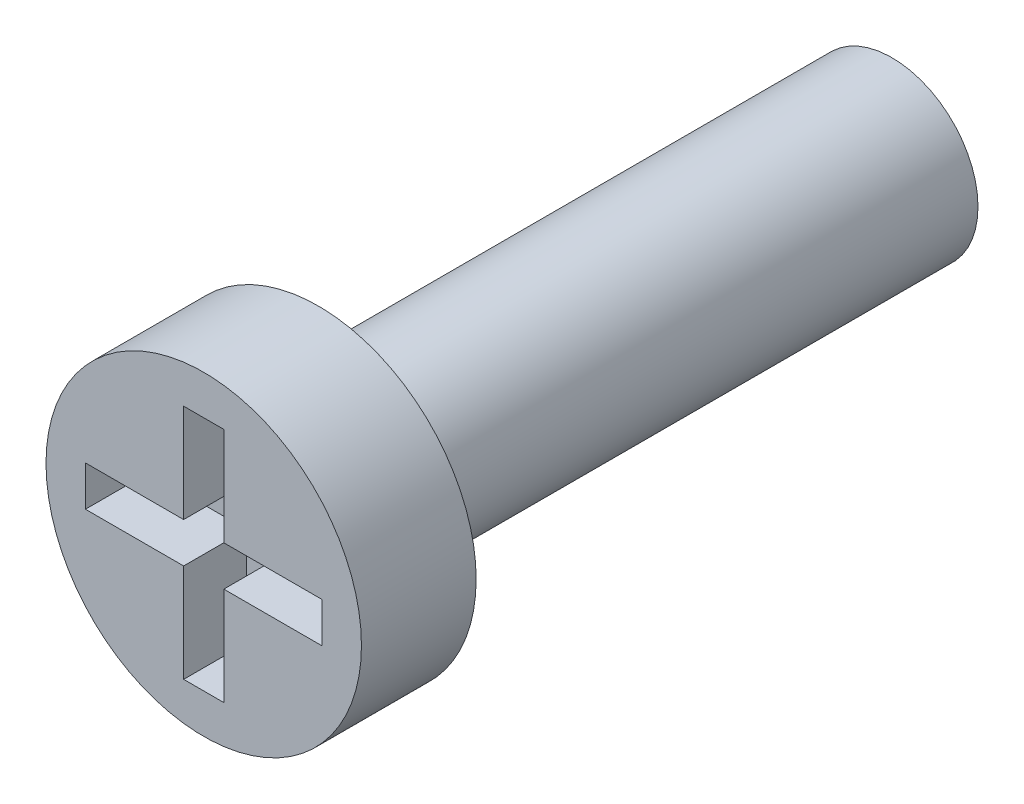
ISO-10303-21;
HEADER;
FILE_DESCRIPTION(('STEP AP214'),'2;1');
FILE_NAME('part.step','',(''),(''),'','','');
FILE_SCHEMA(('AUTOMOTIVE_DESIGN { 1 0 10303 214 1 1 1 1 }'));
ENDSEC;
DATA;
#1=APPLICATION_CONTEXT('core data for automotive mechanical design processes');
#2=APPLICATION_PROTOCOL_DEFINITION('international standard','automotive_design',2000,#1);
#3=PRODUCT_CONTEXT('',#1,'mechanical');
#4=PRODUCT('Part','Part','',(#3));
#5=PRODUCT_RELATED_PRODUCT_CATEGORY('part','',(#4));
#6=PRODUCT_DEFINITION_FORMATION('','',#4);
#7=PRODUCT_DEFINITION_CONTEXT('part definition',#1,'design');
#8=PRODUCT_DEFINITION('design','',#6,#7);
#9=PRODUCT_DEFINITION_SHAPE('','',#8);
#10=(LENGTH_UNIT() NAMED_UNIT(*) SI_UNIT(.MILLI.,.METRE.));
#11=(NAMED_UNIT(*) PLANE_ANGLE_UNIT() SI_UNIT($,.RADIAN.));
#12=(NAMED_UNIT(*) SI_UNIT($,.STERADIAN.) SOLID_ANGLE_UNIT());
#13=UNCERTAINTY_MEASURE_WITH_UNIT(LENGTH_MEASURE(1.E-05),#10,'distance_accuracy_value','');
#14=(GEOMETRIC_REPRESENTATION_CONTEXT(3) GLOBAL_UNCERTAINTY_ASSIGNED_CONTEXT((#13)) GLOBAL_UNIT_ASSIGNED_CONTEXT((#10,
#11,#12)) REPRESENTATION_CONTEXT('',''));
#15=CARTESIAN_POINT('',(0.,0.,0.));
#16=DIRECTION('',(0.,0.,1.));
#17=DIRECTION('',(1.,0.,0.));
#18=AXIS2_PLACEMENT_3D('',#15,#16,#17);
#19=CARTESIAN_POINT('',(0.,-0.35,0.9));
#20=DIRECTION('',(0.,-1.,0.));
#21=DIRECTION('',(0.,0.,-1.));
#22=AXIS2_PLACEMENT_3D('',#19,#20,#21);
#23=PLANE('',#22);
#24=DIRECTION('',(1.,0.,0.));
#25=VECTOR('',#24,1.);
#26=CARTESIAN_POINT('',(0.,-0.35,2.));
#27=LINE('',#26,#25);
#28=CARTESIAN_POINT('',(-2.0625,-0.35,2.));
#29=VERTEX_POINT('',#28);
#30=CARTESIAN_POINT('',(-0.35,-0.35,2.));
#31=VERTEX_POINT('',#30);
#32=EDGE_CURVE('E232',#29,#31,#27,.T.);
#33=ORIENTED_EDGE('',*,*,#32,.T.);
#34=DIRECTION('',(0.,0.,-1.));
#35=VECTOR('',#34,1.);
#36=CARTESIAN_POINT('',(-0.35,-0.35,0.9));
#37=LINE('',#36,#35);
#38=CARTESIAN_POINT('',(-0.35,-0.35,0.9));
#39=VERTEX_POINT('',#38);
#40=EDGE_CURVE('E169',#31,#39,#37,.T.);
#41=ORIENTED_EDGE('',*,*,#40,.T.);
#42=DIRECTION('',(1.,0.,0.));
#43=VECTOR('',#42,1.);
#44=CARTESIAN_POINT('',(0.,-0.35,0.9));
#45=LINE('',#44,#43);
#46=CARTESIAN_POINT('',(-2.0625,-0.35,0.9));
#47=VERTEX_POINT('',#46);
#48=EDGE_CURVE('E174',#47,#39,#45,.T.);
#49=ORIENTED_EDGE('',*,*,#48,.F.);
#50=DIRECTION('',(0.,0.,1.));
#51=VECTOR('',#50,1.);
#52=CARTESIAN_POINT('',(-2.0625,-0.35,0.9));
#53=LINE('',#52,#51);
#54=EDGE_CURVE('E201',#47,#29,#53,.T.);
#55=ORIENTED_EDGE('',*,*,#54,.T.);
#56=EDGE_LOOP('',(#33,#41,#49,#55));
#57=FACE_BOUND('',#56,.T.);
#58=ADVANCED_FACE('F17',(#57),#23,.F.);
#59=CARTESIAN_POINT('',(0.,0.35,0.9));
#60=DIRECTION('',(0.,1.,0.));
#61=DIRECTION('',(0.,0.,1.));
#62=AXIS2_PLACEMENT_3D('',#59,#60,#61);
#63=PLANE('',#62);
#64=DIRECTION('',(-1.,0.,0.));
#65=VECTOR('',#64,1.);
#66=CARTESIAN_POINT('',(0.,0.35,0.9));
#67=LINE('',#66,#65);
#68=CARTESIAN_POINT('',(-0.35,0.35,0.9));
#69=VERTEX_POINT('',#68);
#70=CARTESIAN_POINT('',(-2.0625,0.35,0.9));
#71=VERTEX_POINT('',#70);
#72=EDGE_CURVE('E186',#69,#71,#67,.T.);
#73=ORIENTED_EDGE('',*,*,#72,.F.);
#74=DIRECTION('',(0.,0.,1.));
#75=VECTOR('',#74,1.);
#76=CARTESIAN_POINT('',(-0.35,0.35,0.9));
#77=LINE('',#76,#75);
#78=CARTESIAN_POINT('',(-0.35,0.35,2.));
#79=VERTEX_POINT('',#78);
#80=EDGE_CURVE('E162',#69,#79,#77,.T.);
#81=ORIENTED_EDGE('',*,*,#80,.T.);
#82=DIRECTION('',(-1.,0.,0.));
#83=VECTOR('',#82,1.);
#84=CARTESIAN_POINT('',(0.,0.35,2.));
#85=LINE('',#84,#83);
#86=CARTESIAN_POINT('',(-2.0625,0.35,2.));
#87=VERTEX_POINT('',#86);
#88=EDGE_CURVE('E223',#79,#87,#85,.T.);
#89=ORIENTED_EDGE('',*,*,#88,.T.);
#90=DIRECTION('',(0.,0.,1.));
#91=VECTOR('',#90,1.);
#92=CARTESIAN_POINT('',(-2.0625,0.35,0.9));
#93=LINE('',#92,#91);
#94=EDGE_CURVE('E197',#71,#87,#93,.T.);
#95=ORIENTED_EDGE('',*,*,#94,.F.);
#96=EDGE_LOOP('',(#73,#81,#89,#95));
#97=FACE_BOUND('',#96,.T.);
#98=ADVANCED_FACE('F265',(#97),#63,.F.);
#99=CARTESIAN_POINT('',(0.,0.,-10.));
#100=DIRECTION('',(0.,0.,-1.));
#101=DIRECTION('',(-1.,0.,0.));
#102=AXIS2_PLACEMENT_3D('',#99,#100,#101);
#103=PLANE('',#102);
#104=CARTESIAN_POINT('',(0.,0.,-10.));
#105=DIRECTION('',(0.,0.,1.));
#106=DIRECTION('',(1.,0.,0.));
#107=AXIS2_PLACEMENT_3D('',#104,#105,#106);
#108=CIRCLE('',#107,1.5);
#109=CARTESIAN_POINT('',(1.5,0.,-10.));
#110=VERTEX_POINT('',#109);
#111=EDGE_CURVE('E217',#110,#110,#108,.T.);
#112=ORIENTED_EDGE('',*,*,#111,.F.);
#113=EDGE_LOOP('',(#112));
#114=FACE_BOUND('',#113,.T.);
#115=ADVANCED_FACE('F299',(#114),#103,.T.);
#116=CARTESIAN_POINT('',(0.,0.,-10.));
#117=DIRECTION('',(0.,0.,1.));
#118=DIRECTION('',(1.,0.,0.));
#119=AXIS2_PLACEMENT_3D('',#116,#117,#118);
#120=CYLINDRICAL_SURFACE('',#119,1.5);
#121=CARTESIAN_POINT('',(0.,0.,0.));
#122=DIRECTION('',(0.,0.,-1.));
#123=DIRECTION('',(-1.,0.,0.));
#124=AXIS2_PLACEMENT_3D('',#121,#122,#123);
#125=CIRCLE('',#124,1.5);
#126=CARTESIAN_POINT('',(-1.5,0.,0.));
#127=VERTEX_POINT('',#126);
#128=EDGE_CURVE('E213',#127,#127,#125,.F.);
#129=ORIENTED_EDGE('',*,*,#128,.F.);
#130=EDGE_LOOP('',(#129));
#131=FACE_BOUND('',#130,.T.);
#132=ORIENTED_EDGE('',*,*,#111,.T.);
#133=EDGE_LOOP('',(#132));
#134=FACE_BOUND('',#133,.T.);
#135=ADVANCED_FACE('F19',(#131,#134),#120,.T.);
#136=CARTESIAN_POINT('',(0.,0.,2.));
#137=DIRECTION('',(0.,0.,1.));
#138=DIRECTION('',(1.,0.,0.));
#139=AXIS2_PLACEMENT_3D('',#136,#137,#138);
#140=PLANE('',#139);
#141=DIRECTION('',(0.,-1.,0.));
#142=VECTOR('',#141,1.);
#143=CARTESIAN_POINT('',(-0.35,0.,2.));
#144=LINE('',#143,#142);
#145=CARTESIAN_POINT('',(-0.35,-2.0625,2.));
#146=VERTEX_POINT('',#145);
#147=EDGE_CURVE('E170',#31,#146,#144,.T.);
#148=ORIENTED_EDGE('',*,*,#147,.F.);
#149=ORIENTED_EDGE('',*,*,#32,.F.);
#150=DIRECTION('',(0.,-1.,0.));
#151=VECTOR('',#150,1.);
#152=CARTESIAN_POINT('',(-2.0625,0.,2.));
#153=LINE('',#152,#151);
#154=EDGE_CURVE('E228',#87,#29,#153,.T.);
#155=ORIENTED_EDGE('',*,*,#154,.F.);
#156=ORIENTED_EDGE('',*,*,#88,.F.);
#157=CARTESIAN_POINT('',(-0.35,2.0625,2.));
#158=VERTEX_POINT('',#157);
#159=EDGE_CURVE('E166',#158,#79,#144,.T.);
#160=ORIENTED_EDGE('',*,*,#159,.F.);
#161=DIRECTION('',(-1.,0.,0.));
#162=VECTOR('',#161,1.);
#163=CARTESIAN_POINT('',(0.,2.0625,2.));
#164=LINE('',#163,#162);
#165=CARTESIAN_POINT('',(0.35,2.0625,2.));
#166=VERTEX_POINT('',#165);
#167=EDGE_CURVE('E26',#166,#158,#164,.T.);
#168=ORIENTED_EDGE('',*,*,#167,.F.);
#169=DIRECTION('',(0.,1.,0.));
#170=VECTOR('',#169,1.);
#171=CARTESIAN_POINT('',(0.35,0.,2.));
#172=LINE('',#171,#170);
#173=CARTESIAN_POINT('',(0.35,0.35,2.));
#174=VERTEX_POINT('',#173);
#175=EDGE_CURVE('E157',#174,#166,#172,.T.);
#176=ORIENTED_EDGE('',*,*,#175,.F.);
#177=CARTESIAN_POINT('',(2.0625,0.35,2.));
#178=VERTEX_POINT('',#177);
#179=EDGE_CURVE('E224',#178,#174,#85,.T.);
#180=ORIENTED_EDGE('',*,*,#179,.F.);
#181=DIRECTION('',(0.,1.,0.));
#182=VECTOR('',#181,1.);
#183=CARTESIAN_POINT('',(2.0625,0.,2.));
#184=LINE('',#183,#182);
#185=CARTESIAN_POINT('',(2.0625,-0.35,2.));
#186=VERTEX_POINT('',#185);
#187=EDGE_CURVE('E220',#186,#178,#184,.T.);
#188=ORIENTED_EDGE('',*,*,#187,.F.);
#189=CARTESIAN_POINT('',(0.35,-0.35,2.));
#190=VERTEX_POINT('',#189);
#191=EDGE_CURVE('E231',#190,#186,#27,.T.);
#192=ORIENTED_EDGE('',*,*,#191,.F.);
#193=CARTESIAN_POINT('',(0.35,-2.0625,2.));
#194=VERTEX_POINT('',#193);
#195=EDGE_CURVE('E33',#194,#190,#172,.T.);
#196=ORIENTED_EDGE('',*,*,#195,.F.);
#197=DIRECTION('',(1.,0.,0.));
#198=VECTOR('',#197,1.);
#199=CARTESIAN_POINT('',(0.,-2.0625,2.));
#200=LINE('',#199,#198);
#201=EDGE_CURVE('E11',#146,#194,#200,.T.);
#202=ORIENTED_EDGE('',*,*,#201,.F.);
#203=EDGE_LOOP('',(#148,#149,#155,#156,#160,#168,#176,#180,#188,#192,#196,#202));
#204=FACE_BOUND('',#203,.T.);
#205=CARTESIAN_POINT('',(0.,0.,2.));
#206=DIRECTION('',(0.,0.,-1.));
#207=DIRECTION('',(-1.,0.,0.));
#208=AXIS2_PLACEMENT_3D('',#205,#206,#207);
#209=CIRCLE('',#208,2.75);
#210=CARTESIAN_POINT('',(-2.75,0.,2.));
#211=VERTEX_POINT('',#210);
#212=EDGE_CURVE('E209',#211,#211,#209,.T.);
#213=ORIENTED_EDGE('',*,*,#212,.F.);
#214=EDGE_LOOP('',(#213));
#215=FACE_BOUND('',#214,.T.);
#216=ADVANCED_FACE('F249',(#204,#215),#140,.T.);
#217=CARTESIAN_POINT('',(0.,0.,0.));
#218=DIRECTION('',(0.,0.,-1.));
#219=DIRECTION('',(-1.,0.,0.));
#220=AXIS2_PLACEMENT_3D('',#217,#218,#219);
#221=PLANE('',#220);
#222=ORIENTED_EDGE('',*,*,#128,.T.);
#223=EDGE_LOOP('',(#222));
#224=FACE_BOUND('',#223,.T.);
#225=CARTESIAN_POINT('',(0.,0.,0.));
#226=DIRECTION('',(0.,0.,1.));
#227=DIRECTION('',(1.,0.,0.));
#228=AXIS2_PLACEMENT_3D('',#225,#226,#227);
#229=CIRCLE('',#228,2.75);
#230=CARTESIAN_POINT('',(2.75,0.,0.));
#231=VERTEX_POINT('',#230);
#232=EDGE_CURVE('E205',#231,#231,#229,.T.);
#233=ORIENTED_EDGE('',*,*,#232,.F.);
#234=EDGE_LOOP('',(#233));
#235=FACE_BOUND('',#234,.T.);
#236=ADVANCED_FACE('F308',(#224,#235),#221,.T.);
#237=CARTESIAN_POINT('',(0.,0.,0.));
#238=DIRECTION('',(0.,0.,1.));
#239=DIRECTION('',(1.,0.,0.));
#240=AXIS2_PLACEMENT_3D('',#237,#238,#239);
#241=CYLINDRICAL_SURFACE('',#240,2.75);
#242=ORIENTED_EDGE('',*,*,#212,.T.);
#243=EDGE_LOOP('',(#242));
#244=FACE_BOUND('',#243,.T.);
#245=ORIENTED_EDGE('',*,*,#232,.T.);
#246=EDGE_LOOP('',(#245));
#247=FACE_BOUND('',#246,.T.);
#248=ADVANCED_FACE('F304',(#244,#247),#241,.T.);
#249=CARTESIAN_POINT('',(0.35,-0.35,0.9));
#250=VERTEX_POINT('',#249);
#251=CARTESIAN_POINT('',(2.0625,-0.35,0.9));
#252=VERTEX_POINT('',#251);
#253=EDGE_CURVE('E178',#250,#252,#45,.T.);
#254=ORIENTED_EDGE('',*,*,#253,.F.);
#255=DIRECTION('',(0.,0.,1.));
#256=VECTOR('',#255,1.);
#257=CARTESIAN_POINT('',(0.35,-0.35,0.9));
#258=LINE('',#257,#256);
#259=EDGE_CURVE('E128',#250,#190,#258,.T.);
#260=ORIENTED_EDGE('',*,*,#259,.T.);
#261=ORIENTED_EDGE('',*,*,#191,.T.);
#262=DIRECTION('',(0.,0.,1.));
#263=VECTOR('',#262,1.);
#264=CARTESIAN_POINT('',(2.0625,-0.35,0.9));
#265=LINE('',#264,#263);
#266=EDGE_CURVE('E183',#252,#186,#265,.T.);
#267=ORIENTED_EDGE('',*,*,#266,.F.);
#268=EDGE_LOOP('',(#254,#260,#261,#267));
#269=FACE_BOUND('',#268,.T.);
#270=ADVANCED_FACE('F274',(#269),#23,.F.);
#271=CARTESIAN_POINT('',(-2.0625,0.,0.9));
#272=DIRECTION('',(-1.,0.,0.));
#273=DIRECTION('',(0.,0.,1.));
#274=AXIS2_PLACEMENT_3D('',#271,#272,#273);
#275=PLANE('',#274);
#276=ORIENTED_EDGE('',*,*,#154,.T.);
#277=ORIENTED_EDGE('',*,*,#54,.F.);
#278=DIRECTION('',(0.,-1.,0.));
#279=VECTOR('',#278,1.);
#280=CARTESIAN_POINT('',(-2.0625,0.,0.9));
#281=LINE('',#280,#279);
#282=EDGE_CURVE('E177',#71,#47,#281,.T.);
#283=ORIENTED_EDGE('',*,*,#282,.F.);
#284=ORIENTED_EDGE('',*,*,#94,.T.);
#285=EDGE_LOOP('',(#276,#277,#283,#284));
#286=FACE_BOUND('',#285,.T.);
#287=ADVANCED_FACE('F267',(#286),#275,.F.);
#288=ORIENTED_EDGE('',*,*,#179,.T.);
#289=DIRECTION('',(0.,0.,-1.));
#290=VECTOR('',#289,1.);
#291=CARTESIAN_POINT('',(0.35,0.35,0.9));
#292=LINE('',#291,#290);
#293=CARTESIAN_POINT('',(0.35,0.35,0.9));
#294=VERTEX_POINT('',#293);
#295=EDGE_CURVE('E154',#174,#294,#292,.T.);
#296=ORIENTED_EDGE('',*,*,#295,.T.);
#297=CARTESIAN_POINT('',(2.0625,0.35,0.9));
#298=VERTEX_POINT('',#297);
#299=EDGE_CURVE('E184',#298,#294,#67,.T.);
#300=ORIENTED_EDGE('',*,*,#299,.F.);
#301=DIRECTION('',(0.,0.,1.));
#302=VECTOR('',#301,1.);
#303=CARTESIAN_POINT('',(2.0625,0.35,0.9));
#304=LINE('',#303,#302);
#305=EDGE_CURVE('E193',#298,#178,#304,.T.);
#306=ORIENTED_EDGE('',*,*,#305,.T.);
#307=EDGE_LOOP('',(#288,#296,#300,#306));
#308=FACE_BOUND('',#307,.T.);
#309=ADVANCED_FACE('F282',(#308),#63,.F.);
#310=CARTESIAN_POINT('',(0.,0.,0.9));
#311=DIRECTION('',(0.,0.,-1.));
#312=DIRECTION('',(-1.,0.,0.));
#313=AXIS2_PLACEMENT_3D('',#310,#311,#312);
#314=PLANE('',#313);
#315=ORIENTED_EDGE('',*,*,#299,.T.);
#316=DIRECTION('',(0.,1.,0.));
#317=VECTOR('',#316,1.);
#318=CARTESIAN_POINT('',(0.35,0.,0.9));
#319=LINE('',#318,#317);
#320=CARTESIAN_POINT('',(0.35,2.0625,0.9));
#321=VERTEX_POINT('',#320);
#322=EDGE_CURVE('E41',#294,#321,#319,.T.);
#323=ORIENTED_EDGE('',*,*,#322,.T.);
#324=DIRECTION('',(-1.,0.,0.));
#325=VECTOR('',#324,1.);
#326=CARTESIAN_POINT('',(0.,2.0625,0.9));
#327=LINE('',#326,#325);
#328=CARTESIAN_POINT('',(-0.35,2.0625,0.9));
#329=VERTEX_POINT('',#328);
#330=EDGE_CURVE('E135',#321,#329,#327,.T.);
#331=ORIENTED_EDGE('',*,*,#330,.T.);
#332=DIRECTION('',(0.,-1.,0.));
#333=VECTOR('',#332,1.);
#334=CARTESIAN_POINT('',(-0.35,0.,0.9));
#335=LINE('',#334,#333);
#336=EDGE_CURVE('E140',#329,#69,#335,.T.);
#337=ORIENTED_EDGE('',*,*,#336,.T.);
#338=ORIENTED_EDGE('',*,*,#72,.T.);
#339=ORIENTED_EDGE('',*,*,#282,.T.);
#340=ORIENTED_EDGE('',*,*,#48,.T.);
#341=CARTESIAN_POINT('',(-0.35,-2.0625,0.9));
#342=VERTEX_POINT('',#341);
#343=EDGE_CURVE('E123',#39,#342,#335,.T.);
#344=ORIENTED_EDGE('',*,*,#343,.T.);
#345=DIRECTION('',(1.,0.,0.));
#346=VECTOR('',#345,1.);
#347=CARTESIAN_POINT('',(0.,-2.0625,0.9));
#348=LINE('',#347,#346);
#349=CARTESIAN_POINT('',(0.35,-2.0625,0.9));
#350=VERTEX_POINT('',#349);
#351=EDGE_CURVE('E110',#342,#350,#348,.T.);
#352=ORIENTED_EDGE('',*,*,#351,.T.);
#353=EDGE_CURVE('E115',#350,#250,#319,.T.);
#354=ORIENTED_EDGE('',*,*,#353,.T.);
#355=ORIENTED_EDGE('',*,*,#253,.T.);
#356=DIRECTION('',(0.,1.,0.));
#357=VECTOR('',#356,1.);
#358=CARTESIAN_POINT('',(2.0625,0.,0.9));
#359=LINE('',#358,#357);
#360=EDGE_CURVE('E179',#252,#298,#359,.T.);
#361=ORIENTED_EDGE('',*,*,#360,.T.);
#362=EDGE_LOOP('',(#315,#323,#331,#337,#338,#339,#340,#344,#352,#354,#355,#361));
#363=FACE_BOUND('',#362,.T.);
#364=ADVANCED_FACE('F120',(#363),#314,.F.);
#365=CARTESIAN_POINT('',(2.0625,0.,0.9));
#366=DIRECTION('',(1.,0.,0.));
#367=DIRECTION('',(0.,0.,-1.));
#368=AXIS2_PLACEMENT_3D('',#365,#366,#367);
#369=PLANE('',#368);
#370=ORIENTED_EDGE('',*,*,#187,.T.);
#371=ORIENTED_EDGE('',*,*,#305,.F.);
#372=ORIENTED_EDGE('',*,*,#360,.F.);
#373=ORIENTED_EDGE('',*,*,#266,.T.);
#374=EDGE_LOOP('',(#370,#371,#372,#373));
#375=FACE_BOUND('',#374,.T.);
#376=ADVANCED_FACE('F278',(#375),#369,.F.);
#377=CARTESIAN_POINT('',(0.35,0.,0.9));
#378=DIRECTION('',(1.,0.,0.));
#379=DIRECTION('',(0.,0.,-1.));
#380=AXIS2_PLACEMENT_3D('',#377,#378,#379);
#381=PLANE('',#380);
#382=ORIENTED_EDGE('',*,*,#175,.T.);
#383=DIRECTION('',(0.,0.,1.));
#384=VECTOR('',#383,1.);
#385=CARTESIAN_POINT('',(0.35,2.0625,0.9));
#386=LINE('',#385,#384);
#387=EDGE_CURVE('E114',#321,#166,#386,.T.);
#388=ORIENTED_EDGE('',*,*,#387,.F.);
#389=ORIENTED_EDGE('',*,*,#322,.F.);
#390=ORIENTED_EDGE('',*,*,#295,.F.);
#391=EDGE_LOOP('',(#382,#388,#389,#390));
#392=FACE_BOUND('',#391,.T.);
#393=ADVANCED_FACE('F283',(#392),#381,.F.);
#394=CARTESIAN_POINT('',(-0.35,0.,0.9));
#395=DIRECTION('',(-1.,0.,0.));
#396=DIRECTION('',(0.,0.,1.));
#397=AXIS2_PLACEMENT_3D('',#394,#395,#396);
#398=PLANE('',#397);
#399=ORIENTED_EDGE('',*,*,#159,.T.);
#400=ORIENTED_EDGE('',*,*,#80,.F.);
#401=ORIENTED_EDGE('',*,*,#336,.F.);
#402=DIRECTION('',(0.,0.,1.));
#403=VECTOR('',#402,1.);
#404=CARTESIAN_POINT('',(-0.35,2.0625,0.9));
#405=LINE('',#404,#403);
#406=EDGE_CURVE('E147',#329,#158,#405,.T.);
#407=ORIENTED_EDGE('',*,*,#406,.T.);
#408=EDGE_LOOP('',(#399,#400,#401,#407));
#409=FACE_BOUND('',#408,.T.);
#410=ADVANCED_FACE('F246',(#409),#398,.F.);
#411=CARTESIAN_POINT('',(0.,2.0625,0.9));
#412=DIRECTION('',(0.,1.,0.));
#413=DIRECTION('',(0.,0.,1.));
#414=AXIS2_PLACEMENT_3D('',#411,#412,#413);
#415=PLANE('',#414);
#416=ORIENTED_EDGE('',*,*,#167,.T.);
#417=ORIENTED_EDGE('',*,*,#406,.F.);
#418=ORIENTED_EDGE('',*,*,#330,.F.);
#419=ORIENTED_EDGE('',*,*,#387,.T.);
#420=EDGE_LOOP('',(#416,#417,#418,#419));
#421=FACE_BOUND('',#420,.T.);
#422=ADVANCED_FACE('F239',(#421),#415,.F.);
#423=ORIENTED_EDGE('',*,*,#147,.T.);
#424=DIRECTION('',(0.,0.,1.));
#425=VECTOR('',#424,1.);
#426=CARTESIAN_POINT('',(-0.35,-2.0625,0.9));
#427=LINE('',#426,#425);
#428=EDGE_CURVE('E151',#342,#146,#427,.T.);
#429=ORIENTED_EDGE('',*,*,#428,.F.);
#430=ORIENTED_EDGE('',*,*,#343,.F.);
#431=ORIENTED_EDGE('',*,*,#40,.F.);
#432=EDGE_LOOP('',(#423,#429,#430,#431));
#433=FACE_BOUND('',#432,.T.);
#434=ADVANCED_FACE('F291',(#433),#398,.F.);
#435=ORIENTED_EDGE('',*,*,#195,.T.);
#436=ORIENTED_EDGE('',*,*,#259,.F.);
#437=ORIENTED_EDGE('',*,*,#353,.F.);
#438=DIRECTION('',(0.,0.,1.));
#439=VECTOR('',#438,1.);
#440=CARTESIAN_POINT('',(0.35,-2.0625,0.9));
#441=LINE('',#440,#439);
#442=EDGE_CURVE('E106',#350,#194,#441,.T.);
#443=ORIENTED_EDGE('',*,*,#442,.T.);
#444=EDGE_LOOP('',(#435,#436,#437,#443));
#445=FACE_BOUND('',#444,.T.);
#446=ADVANCED_FACE('F127',(#445),#381,.F.);
#447=CARTESIAN_POINT('',(0.,-2.0625,0.9));
#448=DIRECTION('',(0.,-1.,0.));
#449=DIRECTION('',(0.,0.,-1.));
#450=AXIS2_PLACEMENT_3D('',#447,#448,#449);
#451=PLANE('',#450);
#452=ORIENTED_EDGE('',*,*,#201,.T.);
#453=ORIENTED_EDGE('',*,*,#442,.F.);
#454=ORIENTED_EDGE('',*,*,#351,.F.);
#455=ORIENTED_EDGE('',*,*,#428,.T.);
#456=EDGE_LOOP('',(#452,#453,#454,#455));
#457=FACE_BOUND('',#456,.T.);
#458=ADVANCED_FACE('F108',(#457),#451,.F.);
#459=CLOSED_SHELL('',(#58,#98,#115,#135,#216,#236,#248,#270,#287,#309,#364,#376,#393,#410,#422,
#434,#446,#458));
#460=MANIFOLD_SOLID_BREP('B1',#459);
#461=ADVANCED_BREP_SHAPE_REPRESENTATION('',(#18,#460),#14);
#462=SHAPE_DEFINITION_REPRESENTATION(#9,#461);
ENDSEC;
END-ISO-10303-21;
